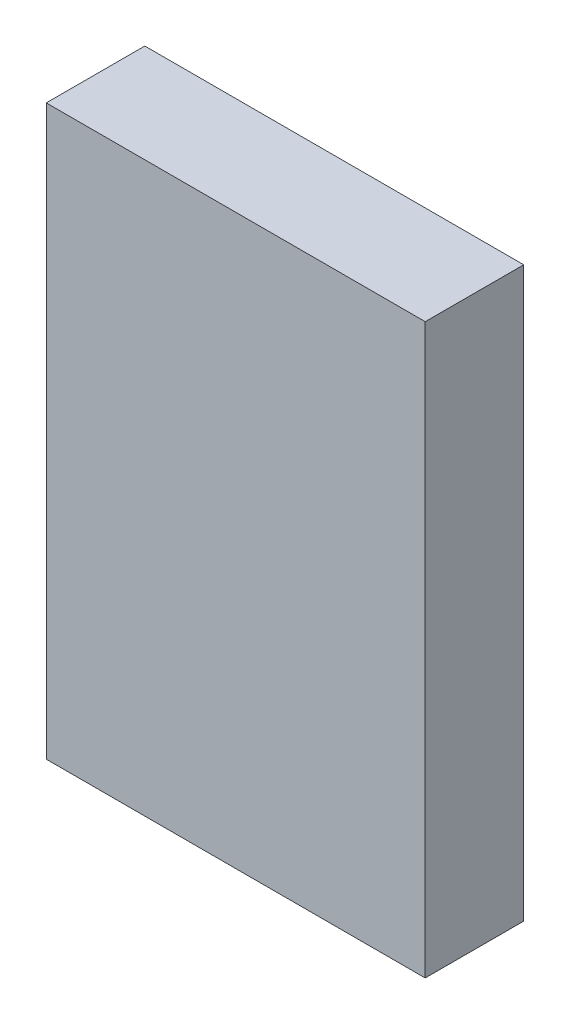
ISO-10303-21;
HEADER;
FILE_DESCRIPTION(('STEP AP214'),'2;1');
FILE_NAME('part.step','',(''),(''),'','','');
FILE_SCHEMA(('AUTOMOTIVE_DESIGN { 1 0 10303 214 1 1 1 1 }'));
ENDSEC;
DATA;
#1=APPLICATION_CONTEXT('core data for automotive mechanical design processes');
#2=APPLICATION_PROTOCOL_DEFINITION('international standard','automotive_design',2000,#1);
#3=PRODUCT_CONTEXT('',#1,'mechanical');
#4=PRODUCT('Part','Part','',(#3));
#5=PRODUCT_RELATED_PRODUCT_CATEGORY('part','',(#4));
#6=PRODUCT_DEFINITION_FORMATION('','',#4);
#7=PRODUCT_DEFINITION_CONTEXT('part definition',#1,'design');
#8=PRODUCT_DEFINITION('design','',#6,#7);
#9=PRODUCT_DEFINITION_SHAPE('','',#8);
#10=(LENGTH_UNIT() NAMED_UNIT(*) SI_UNIT(.MILLI.,.METRE.));
#11=(NAMED_UNIT(*) PLANE_ANGLE_UNIT() SI_UNIT($,.RADIAN.));
#12=(NAMED_UNIT(*) SI_UNIT($,.STERADIAN.) SOLID_ANGLE_UNIT());
#13=UNCERTAINTY_MEASURE_WITH_UNIT(LENGTH_MEASURE(1.E-05),#10,'distance_accuracy_value','');
#14=(GEOMETRIC_REPRESENTATION_CONTEXT(3) GLOBAL_UNCERTAINTY_ASSIGNED_CONTEXT((#13)) GLOBAL_UNIT_ASSIGNED_CONTEXT((#10,
#11,#12)) REPRESENTATION_CONTEXT('',''));
#15=CARTESIAN_POINT('',(0.,0.,0.));
#16=DIRECTION('',(0.,0.,1.));
#17=DIRECTION('',(1.,0.,0.));
#18=AXIS2_PLACEMENT_3D('',#15,#16,#17);
#19=CARTESIAN_POINT('',(5.,-7.5,2.6));
#20=DIRECTION('',(-1.,0.,0.));
#21=DIRECTION('',(0.,0.,1.));
#22=AXIS2_PLACEMENT_3D('',#19,#20,#21);
#23=PLANE('',#22);
#24=DIRECTION('',(0.,1.,0.));
#25=VECTOR('',#24,1.);
#26=CARTESIAN_POINT('',(5.,-7.5,0.));
#27=LINE('',#26,#25);
#28=CARTESIAN_POINT('',(5.,-7.5,0.));
#29=VERTEX_POINT('',#28);
#30=CARTESIAN_POINT('',(5.,7.5,0.));
#31=VERTEX_POINT('',#30);
#32=EDGE_CURVE('E104',#29,#31,#27,.T.);
#33=ORIENTED_EDGE('',*,*,#32,.T.);
#34=DIRECTION('',(0.,0.,-1.));
#35=VECTOR('',#34,1.);
#36=CARTESIAN_POINT('',(5.,7.5,2.6));
#37=LINE('',#36,#35);
#38=CARTESIAN_POINT('',(5.,7.5,2.6));
#39=VERTEX_POINT('',#38);
#40=EDGE_CURVE('E11',#39,#31,#37,.T.);
#41=ORIENTED_EDGE('',*,*,#40,.F.);
#42=DIRECTION('',(0.,1.,0.));
#43=VECTOR('',#42,1.);
#44=CARTESIAN_POINT('',(5.,-7.5,2.6));
#45=LINE('',#44,#43);
#46=CARTESIAN_POINT('',(5.,-7.5,2.6));
#47=VERTEX_POINT('',#46);
#48=EDGE_CURVE('E92',#47,#39,#45,.T.);
#49=ORIENTED_EDGE('',*,*,#48,.F.);
#50=DIRECTION('',(0.,0.,-1.));
#51=VECTOR('',#50,1.);
#52=CARTESIAN_POINT('',(5.,-7.5,2.6));
#53=LINE('',#52,#51);
#54=EDGE_CURVE('E100',#47,#29,#53,.T.);
#55=ORIENTED_EDGE('',*,*,#54,.T.);
#56=EDGE_LOOP('',(#33,#41,#49,#55));
#57=FACE_BOUND('',#56,.T.);
#58=ADVANCED_FACE('F41',(#57),#23,.F.);
#59=CARTESIAN_POINT('',(-5.,7.5,2.6));
#60=DIRECTION('',(0.,-1.,0.));
#61=DIRECTION('',(0.,0.,-1.));
#62=AXIS2_PLACEMENT_3D('',#59,#60,#61);
#63=PLANE('',#62);
#64=DIRECTION('',(-1.,0.,0.));
#65=VECTOR('',#64,1.);
#66=CARTESIAN_POINT('',(-5.,7.5,0.));
#67=LINE('',#66,#65);
#68=CARTESIAN_POINT('',(-5.,7.5,0.));
#69=VERTEX_POINT('',#68);
#70=EDGE_CURVE('E96',#31,#69,#67,.T.);
#71=ORIENTED_EDGE('',*,*,#70,.T.);
#72=DIRECTION('',(0.,0.,-1.));
#73=VECTOR('',#72,1.);
#74=CARTESIAN_POINT('',(-5.,7.5,2.6));
#75=LINE('',#74,#73);
#76=CARTESIAN_POINT('',(-5.,7.5,2.6));
#77=VERTEX_POINT('',#76);
#78=EDGE_CURVE('E49',#77,#69,#75,.T.);
#79=ORIENTED_EDGE('',*,*,#78,.F.);
#80=DIRECTION('',(-1.,0.,0.));
#81=VECTOR('',#80,1.);
#82=CARTESIAN_POINT('',(-5.,7.5,2.6));
#83=LINE('',#82,#81);
#84=EDGE_CURVE('E87',#39,#77,#83,.T.);
#85=ORIENTED_EDGE('',*,*,#84,.F.);
#86=ORIENTED_EDGE('',*,*,#40,.T.);
#87=EDGE_LOOP('',(#71,#79,#85,#86));
#88=FACE_BOUND('',#87,.T.);
#89=ADVANCED_FACE('F95',(#88),#63,.F.);
#90=CARTESIAN_POINT('',(-5.,-7.5,2.6));
#91=DIRECTION('',(1.,0.,0.));
#92=DIRECTION('',(0.,0.,-1.));
#93=AXIS2_PLACEMENT_3D('',#90,#91,#92);
#94=PLANE('',#93);
#95=DIRECTION('',(0.,-1.,0.));
#96=VECTOR('',#95,1.);
#97=CARTESIAN_POINT('',(-5.,-7.5,0.));
#98=LINE('',#97,#96);
#99=CARTESIAN_POINT('',(-5.,-7.5,0.));
#100=VERTEX_POINT('',#99);
#101=EDGE_CURVE('E74',#69,#100,#98,.T.);
#102=ORIENTED_EDGE('',*,*,#101,.T.);
#103=DIRECTION('',(0.,0.,-1.));
#104=VECTOR('',#103,1.);
#105=CARTESIAN_POINT('',(-5.,-7.5,2.6));
#106=LINE('',#105,#104);
#107=CARTESIAN_POINT('',(-5.,-7.5,2.6));
#108=VERTEX_POINT('',#107);
#109=EDGE_CURVE('E97',#108,#100,#106,.T.);
#110=ORIENTED_EDGE('',*,*,#109,.F.);
#111=DIRECTION('',(0.,-1.,0.));
#112=VECTOR('',#111,1.);
#113=CARTESIAN_POINT('',(-5.,-7.5,2.6));
#114=LINE('',#113,#112);
#115=EDGE_CURVE('E90',#77,#108,#114,.T.);
#116=ORIENTED_EDGE('',*,*,#115,.F.);
#117=ORIENTED_EDGE('',*,*,#78,.T.);
#118=EDGE_LOOP('',(#102,#110,#116,#117));
#119=FACE_BOUND('',#118,.T.);
#120=ADVANCED_FACE('F98',(#119),#94,.F.);
#121=CARTESIAN_POINT('',(-5.,-7.5,2.6));
#122=DIRECTION('',(0.,1.,0.));
#123=DIRECTION('',(0.,0.,1.));
#124=AXIS2_PLACEMENT_3D('',#121,#122,#123);
#125=PLANE('',#124);
#126=DIRECTION('',(1.,0.,0.));
#127=VECTOR('',#126,1.);
#128=CARTESIAN_POINT('',(-5.,-7.5,0.));
#129=LINE('',#128,#127);
#130=EDGE_CURVE('E80',#100,#29,#129,.T.);
#131=ORIENTED_EDGE('',*,*,#130,.T.);
#132=ORIENTED_EDGE('',*,*,#54,.F.);
#133=DIRECTION('',(1.,0.,0.));
#134=VECTOR('',#133,1.);
#135=CARTESIAN_POINT('',(-5.,-7.5,2.6));
#136=LINE('',#135,#134);
#137=EDGE_CURVE('E57',#108,#47,#136,.T.);
#138=ORIENTED_EDGE('',*,*,#137,.F.);
#139=ORIENTED_EDGE('',*,*,#109,.T.);
#140=EDGE_LOOP('',(#131,#132,#138,#139));
#141=FACE_BOUND('',#140,.T.);
#142=ADVANCED_FACE('F111',(#141),#125,.F.);
#143=CARTESIAN_POINT('',(0.,0.,2.6));
#144=DIRECTION('',(0.,0.,-1.));
#145=DIRECTION('',(-1.,0.,0.));
#146=AXIS2_PLACEMENT_3D('',#143,#144,#145);
#147=PLANE('',#146);
#148=ORIENTED_EDGE('',*,*,#48,.T.);
#149=ORIENTED_EDGE('',*,*,#84,.T.);
#150=ORIENTED_EDGE('',*,*,#115,.T.);
#151=ORIENTED_EDGE('',*,*,#137,.T.);
#152=EDGE_LOOP('',(#148,#149,#150,#151));
#153=FACE_BOUND('',#152,.T.);
#154=ADVANCED_FACE('F88',(#153),#147,.F.);
#155=CARTESIAN_POINT('',(0.,0.,0.));
#156=DIRECTION('',(0.,0.,-1.));
#157=DIRECTION('',(-1.,0.,0.));
#158=AXIS2_PLACEMENT_3D('',#155,#156,#157);
#159=PLANE('',#158);
#160=ORIENTED_EDGE('',*,*,#32,.F.);
#161=ORIENTED_EDGE('',*,*,#130,.F.);
#162=ORIENTED_EDGE('',*,*,#101,.F.);
#163=ORIENTED_EDGE('',*,*,#70,.F.);
#164=EDGE_LOOP('',(#160,#161,#162,#163));
#165=FACE_BOUND('',#164,.T.);
#166=ADVANCED_FACE('F114',(#165),#159,.T.);
#167=CLOSED_SHELL('',(#58,#89,#120,#142,#154,#166));
#168=MANIFOLD_SOLID_BREP('B2',#167);
#169=ADVANCED_BREP_SHAPE_REPRESENTATION('',(#18,#168),#14);
#170=SHAPE_DEFINITION_REPRESENTATION(#9,#169);
ENDSEC;
END-ISO-10303-21;
